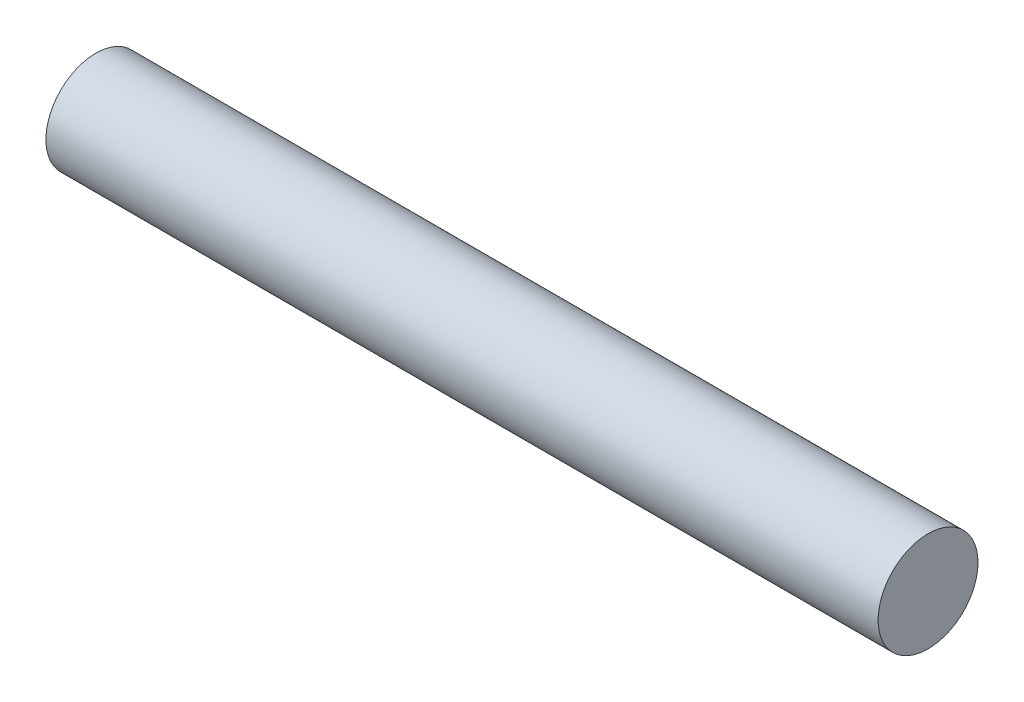
ISO-10303-21;
HEADER;
FILE_DESCRIPTION(('STEP AP214'),'2;1');
FILE_NAME('part.step','',(''),(''),'','','');
FILE_SCHEMA(('AUTOMOTIVE_DESIGN { 1 0 10303 214 1 1 1 1 }'));
ENDSEC;
DATA;
#1=APPLICATION_CONTEXT('core data for automotive mechanical design processes');
#2=APPLICATION_PROTOCOL_DEFINITION('international standard','automotive_design',2000,#1);
#3=PRODUCT_CONTEXT('',#1,'mechanical');
#4=PRODUCT('Part','Part','',(#3));
#5=PRODUCT_RELATED_PRODUCT_CATEGORY('part','',(#4));
#6=PRODUCT_DEFINITION_FORMATION('','',#4);
#7=PRODUCT_DEFINITION_CONTEXT('part definition',#1,'design');
#8=PRODUCT_DEFINITION('design','',#6,#7);
#9=PRODUCT_DEFINITION_SHAPE('','',#8);
#10=(LENGTH_UNIT() NAMED_UNIT(*) SI_UNIT(.MILLI.,.METRE.));
#11=(NAMED_UNIT(*) PLANE_ANGLE_UNIT() SI_UNIT($,.RADIAN.));
#12=(NAMED_UNIT(*) SI_UNIT($,.STERADIAN.) SOLID_ANGLE_UNIT());
#13=UNCERTAINTY_MEASURE_WITH_UNIT(LENGTH_MEASURE(1.E-05),#10,'distance_accuracy_value','');
#14=(GEOMETRIC_REPRESENTATION_CONTEXT(3) GLOBAL_UNCERTAINTY_ASSIGNED_CONTEXT((#13)) GLOBAL_UNIT_ASSIGNED_CONTEXT((#10,
#11,#12)) REPRESENTATION_CONTEXT('',''));
#15=CARTESIAN_POINT('',(0.,0.,0.));
#16=DIRECTION('',(0.,0.,1.));
#17=DIRECTION('',(1.,0.,0.));
#18=AXIS2_PLACEMENT_3D('',#15,#16,#17);
#19=CARTESIAN_POINT('',(25.,0.,0.));
#20=DIRECTION('',(-1.,0.,0.));
#21=DIRECTION('',(0.,0.,1.));
#22=AXIS2_PLACEMENT_3D('',#19,#20,#21);
#23=CYLINDRICAL_SURFACE('',#22,3.00000000000011);
#24=CARTESIAN_POINT('',(25.,0.,0.));
#25=DIRECTION('',(1.,0.,0.));
#26=DIRECTION('',(0.,0.,-1.));
#27=AXIS2_PLACEMENT_3D('',#24,#25,#26);
#28=CIRCLE('',#27,3.00000000000011);
#29=CARTESIAN_POINT('',(25.,0.,-3.00000000000011));
#30=VERTEX_POINT('',#29);
#31=EDGE_CURVE('E10',#30,#30,#28,.T.);
#32=ORIENTED_EDGE('',*,*,#31,.F.);
#33=EDGE_LOOP('',(#32));
#34=FACE_BOUND('',#33,.T.);
#35=CARTESIAN_POINT('',(-25.,0.,0.));
#36=DIRECTION('',(1.,0.,0.));
#37=DIRECTION('',(0.,0.,-1.));
#38=AXIS2_PLACEMENT_3D('',#35,#36,#37);
#39=CIRCLE('',#38,3.00000000000011);
#40=CARTESIAN_POINT('',(-25.,0.,-3.00000000000011));
#41=VERTEX_POINT('',#40);
#42=EDGE_CURVE('E46',#41,#41,#39,.T.);
#43=ORIENTED_EDGE('',*,*,#42,.T.);
#44=EDGE_LOOP('',(#43));
#45=FACE_BOUND('',#44,.T.);
#46=ADVANCED_FACE('F43',(#34,#45),#23,.T.);
#47=CARTESIAN_POINT('',(25.,0.,0.));
#48=DIRECTION('',(1.,0.,0.));
#49=DIRECTION('',(0.,0.,-1.));
#50=AXIS2_PLACEMENT_3D('',#47,#48,#49);
#51=PLANE('',#50);
#52=ORIENTED_EDGE('',*,*,#31,.T.);
#53=EDGE_LOOP('',(#52));
#54=FACE_BOUND('',#53,.T.);
#55=ADVANCED_FACE('F60',(#54),#51,.T.);
#56=CARTESIAN_POINT('',(-25.,0.,0.));
#57=DIRECTION('',(1.,0.,0.));
#58=DIRECTION('',(0.,0.,-1.));
#59=AXIS2_PLACEMENT_3D('',#56,#57,#58);
#60=PLANE('',#59);
#61=ORIENTED_EDGE('',*,*,#42,.F.);
#62=EDGE_LOOP('',(#61));
#63=FACE_BOUND('',#62,.T.);
#64=ADVANCED_FACE('F58',(#63),#60,.F.);
#65=CLOSED_SHELL('',(#46,#55,#64));
#66=MANIFOLD_SOLID_BREP('B2',#65);
#67=ADVANCED_BREP_SHAPE_REPRESENTATION('',(#18,#66),#14);
#68=SHAPE_DEFINITION_REPRESENTATION(#9,#67);
ENDSEC;
END-ISO-10303-21;
